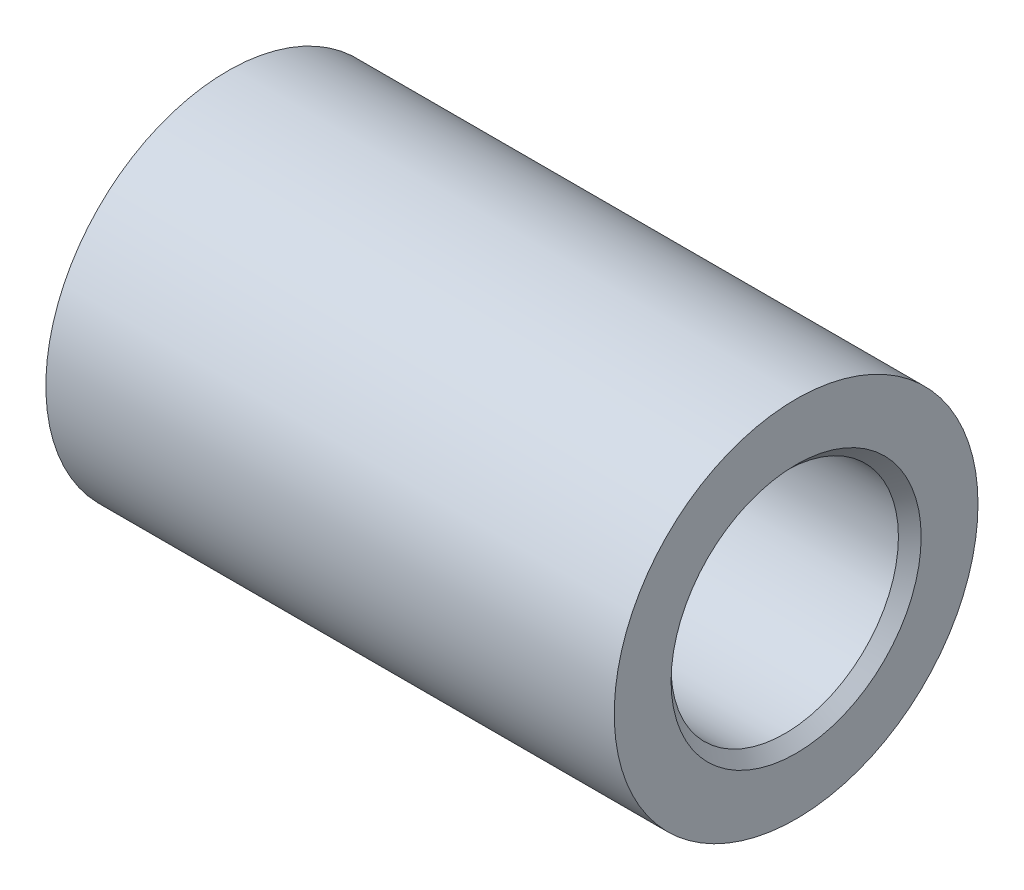
ISO-10303-21;
HEADER;
FILE_DESCRIPTION(('STEP AP214'),'2;1');
FILE_NAME('part.step','',(''),(''),'','','');
FILE_SCHEMA(('AUTOMOTIVE_DESIGN { 1 0 10303 214 1 1 1 1 }'));
ENDSEC;
DATA;
#1=APPLICATION_CONTEXT('core data for automotive mechanical design processes');
#2=APPLICATION_PROTOCOL_DEFINITION('international standard','automotive_design',2000,#1);
#3=PRODUCT_CONTEXT('',#1,'mechanical');
#4=PRODUCT('Part','Part','',(#3));
#5=PRODUCT_RELATED_PRODUCT_CATEGORY('part','',(#4));
#6=PRODUCT_DEFINITION_FORMATION('','',#4);
#7=PRODUCT_DEFINITION_CONTEXT('part definition',#1,'design');
#8=PRODUCT_DEFINITION('design','',#6,#7);
#9=PRODUCT_DEFINITION_SHAPE('','',#8);
#10=(LENGTH_UNIT() NAMED_UNIT(*) SI_UNIT(.MILLI.,.METRE.));
#11=(NAMED_UNIT(*) PLANE_ANGLE_UNIT() SI_UNIT($,.RADIAN.));
#12=(NAMED_UNIT(*) SI_UNIT($,.STERADIAN.) SOLID_ANGLE_UNIT());
#13=UNCERTAINTY_MEASURE_WITH_UNIT(LENGTH_MEASURE(1.E-05),#10,'distance_accuracy_value','');
#14=(GEOMETRIC_REPRESENTATION_CONTEXT(3) GLOBAL_UNCERTAINTY_ASSIGNED_CONTEXT((#13)) GLOBAL_UNIT_ASSIGNED_CONTEXT((#10,
#11,#12)) REPRESENTATION_CONTEXT('',''));
#15=CARTESIAN_POINT('',(0.,0.,0.));
#16=DIRECTION('',(0.,0.,1.));
#17=DIRECTION('',(1.,0.,0.));
#18=AXIS2_PLACEMENT_3D('',#15,#16,#17);
#19=CARTESIAN_POINT('',(2.5759059151294,0.920384486513654,0.));
#20=DIRECTION('',(1.,0.,0.));
#21=DIRECTION('',(0.,0.,-1.));
#22=AXIS2_PLACEMENT_3D('',#19,#20,#21);
#23=PLANE('',#22);
#24=CARTESIAN_POINT('',(2.5759059151294,-0.179615513486346,0.));
#25=DIRECTION('',(1.,0.,0.));
#26=DIRECTION('',(0.,0.,-1.));
#27=AXIS2_PLACEMENT_3D('',#24,#25,#26);
#28=CIRCLE('',#27,1.6);
#29=CARTESIAN_POINT('',(2.5759059151294,-0.179615513486346,-1.6));
#30=VERTEX_POINT('',#29);
#31=EDGE_CURVE('E10',#30,#30,#28,.T.);
#32=ORIENTED_EDGE('',*,*,#31,.T.);
#33=EDGE_LOOP('',(#32));
#34=FACE_BOUND('',#33,.T.);
#35=CARTESIAN_POINT('',(2.5759059151294,-0.179615513486346,0.));
#36=DIRECTION('',(1.,0.,0.));
#37=DIRECTION('',(0.,0.,-1.));
#38=AXIS2_PLACEMENT_3D('',#35,#36,#37);
#39=CIRCLE('',#38,1.1);
#40=CARTESIAN_POINT('',(2.5759059151294,-0.179615513486346,-1.1));
#41=VERTEX_POINT('',#40);
#42=EDGE_CURVE('E69',#41,#41,#39,.T.);
#43=ORIENTED_EDGE('',*,*,#42,.F.);
#44=EDGE_LOOP('',(#43));
#45=FACE_BOUND('',#44,.T.);
#46=ADVANCED_FACE('F43',(#34,#45),#23,.T.);
#47=CARTESIAN_POINT('',(-2.5,-0.179615513486346,0.));
#48=DIRECTION('',(1.,0.,0.));
#49=DIRECTION('',(0.,0.,-1.));
#50=AXIS2_PLACEMENT_3D('',#47,#48,#49);
#51=CYLINDRICAL_SURFACE('',#50,1.6);
#52=CARTESIAN_POINT('',(-2.4240940848706,-0.179615513486346,0.));
#53=DIRECTION('',(1.,0.,0.));
#54=DIRECTION('',(0.,0.,-1.));
#55=AXIS2_PLACEMENT_3D('',#52,#53,#54);
#56=CIRCLE('',#55,1.6);
#57=CARTESIAN_POINT('',(-2.4240940848706,-0.179615513486346,-1.6));
#58=VERTEX_POINT('',#57);
#59=EDGE_CURVE('E49',#58,#58,#56,.T.);
#60=ORIENTED_EDGE('',*,*,#59,.T.);
#61=EDGE_LOOP('',(#60));
#62=FACE_BOUND('',#61,.T.);
#63=ORIENTED_EDGE('',*,*,#31,.F.);
#64=EDGE_LOOP('',(#63));
#65=FACE_BOUND('',#64,.T.);
#66=ADVANCED_FACE('F78',(#62,#65),#51,.T.);
#67=CARTESIAN_POINT('',(-2.4240940848706,1.42038448651365,0.));
#68=DIRECTION('',(-1.,0.,0.));
#69=DIRECTION('',(0.,0.,1.));
#70=AXIS2_PLACEMENT_3D('',#67,#68,#69);
#71=PLANE('',#70);
#72=CARTESIAN_POINT('',(-2.4240940848706,-0.179615513486346,0.));
#73=DIRECTION('',(1.,0.,0.));
#74=DIRECTION('',(0.,0.,-1.));
#75=AXIS2_PLACEMENT_3D('',#72,#73,#74);
#76=CIRCLE('',#75,1.1);
#77=CARTESIAN_POINT('',(-2.4240940848706,-0.179615513486346,-1.1));
#78=VERTEX_POINT('',#77);
#79=EDGE_CURVE('E54',#78,#78,#76,.T.);
#80=ORIENTED_EDGE('',*,*,#79,.T.);
#81=EDGE_LOOP('',(#80));
#82=FACE_BOUND('',#81,.T.);
#83=ORIENTED_EDGE('',*,*,#59,.F.);
#84=EDGE_LOOP('',(#83));
#85=FACE_BOUND('',#84,.T.);
#86=ADVANCED_FACE('F83',(#82,#85),#71,.T.);
#87=CARTESIAN_POINT('',(-2.4240940848706,-0.179615513486346,0.));
#88=DIRECTION('',(-1.,0.,0.));
#89=DIRECTION('',(0.,0.,1.));
#90=AXIS2_PLACEMENT_3D('',#87,#88,#89);
#91=CONICAL_SURFACE('',#90,1.1,0.785398163397449);
#92=CARTESIAN_POINT('',(-2.3240940848706,-0.179615513486346,0.));
#93=DIRECTION('',(1.,0.,0.));
#94=DIRECTION('',(0.,0.,-1.));
#95=AXIS2_PLACEMENT_3D('',#92,#93,#94);
#96=CIRCLE('',#95,1.);
#97=CARTESIAN_POINT('',(-2.3240940848706,-0.179615513486346,-1.));
#98=VERTEX_POINT('',#97);
#99=EDGE_CURVE('E58',#98,#98,#96,.T.);
#100=ORIENTED_EDGE('',*,*,#99,.T.);
#101=EDGE_LOOP('',(#100));
#102=FACE_BOUND('',#101,.T.);
#103=ORIENTED_EDGE('',*,*,#79,.F.);
#104=EDGE_LOOP('',(#103));
#105=FACE_BOUND('',#104,.T.);
#106=ADVANCED_FACE('F87',(#102,#105),#91,.F.);
#107=CARTESIAN_POINT('',(-2.5,-0.179615513486346,0.));
#108=DIRECTION('',(1.,0.,0.));
#109=DIRECTION('',(0.,0.,-1.));
#110=AXIS2_PLACEMENT_3D('',#107,#108,#109);
#111=CYLINDRICAL_SURFACE('',#110,1.);
#112=CARTESIAN_POINT('',(2.4759059151294,-0.179615513486346,0.));
#113=DIRECTION('',(1.,0.,0.));
#114=DIRECTION('',(0.,0.,-1.));
#115=AXIS2_PLACEMENT_3D('',#112,#113,#114);
#116=CIRCLE('',#115,1.);
#117=CARTESIAN_POINT('',(2.4759059151294,-0.179615513486346,-1.));
#118=VERTEX_POINT('',#117);
#119=EDGE_CURVE('E66',#118,#118,#116,.T.);
#120=ORIENTED_EDGE('',*,*,#119,.T.);
#121=EDGE_LOOP('',(#120));
#122=FACE_BOUND('',#121,.T.);
#123=ORIENTED_EDGE('',*,*,#99,.F.);
#124=EDGE_LOOP('',(#123));
#125=FACE_BOUND('',#124,.T.);
#126=ADVANCED_FACE('F94',(#122,#125),#111,.F.);
#127=CARTESIAN_POINT('',(2.4759059151294,-0.179615513486346,0.));
#128=DIRECTION('',(1.,0.,0.));
#129=DIRECTION('',(0.,0.,-1.));
#130=AXIS2_PLACEMENT_3D('',#127,#128,#129);
#131=CONICAL_SURFACE('',#130,1.,0.785398163397453);
#132=ORIENTED_EDGE('',*,*,#42,.T.);
#133=EDGE_LOOP('',(#132));
#134=FACE_BOUND('',#133,.T.);
#135=ORIENTED_EDGE('',*,*,#119,.F.);
#136=EDGE_LOOP('',(#135));
#137=FACE_BOUND('',#136,.T.);
#138=ADVANCED_FACE('F73',(#134,#137),#131,.F.);
#139=CLOSED_SHELL('',(#46,#66,#86,#106,#126,#138));
#140=MANIFOLD_SOLID_BREP('B2',#139);
#141=ADVANCED_BREP_SHAPE_REPRESENTATION('',(#18,#140),#14);
#142=SHAPE_DEFINITION_REPRESENTATION(#9,#141);
ENDSEC;
END-ISO-10303-21;
